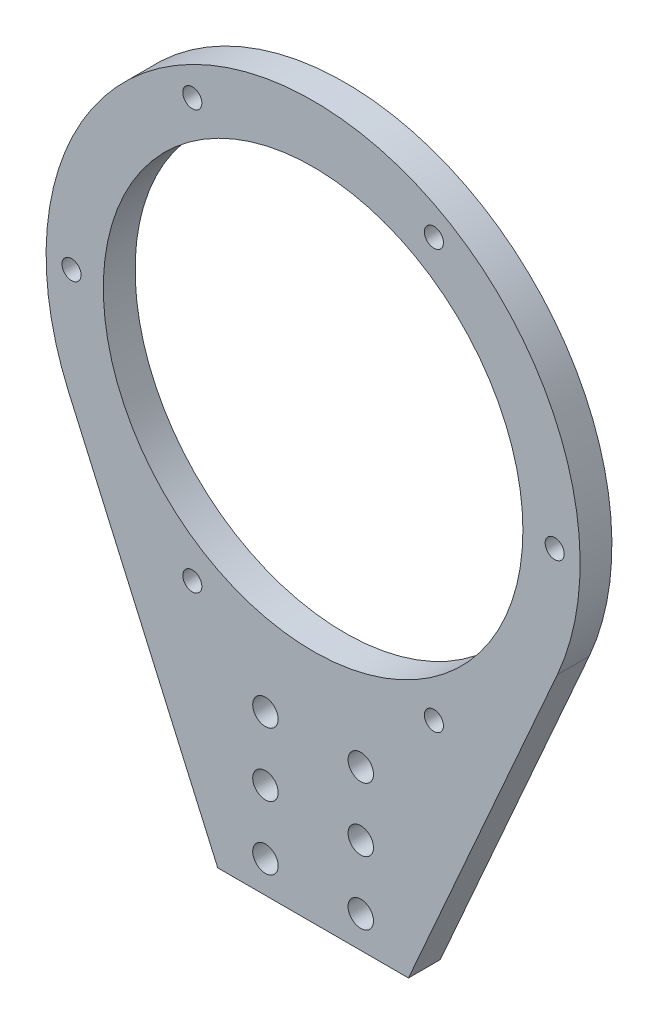
ISO-10303-21;
HEADER;
FILE_DESCRIPTION(('STEP AP214'),'2;1');
FILE_NAME('part.step','',(''),(''),'','','');
FILE_SCHEMA(('AUTOMOTIVE_DESIGN { 1 0 10303 214 1 1 1 1 }'));
ENDSEC;
DATA;
#1=APPLICATION_CONTEXT('core data for automotive mechanical design processes');
#2=APPLICATION_PROTOCOL_DEFINITION('international standard','automotive_design',2000,#1);
#3=PRODUCT_CONTEXT('',#1,'mechanical');
#4=PRODUCT('Part','Part','',(#3));
#5=PRODUCT_RELATED_PRODUCT_CATEGORY('part','',(#4));
#6=PRODUCT_DEFINITION_FORMATION('','',#4);
#7=PRODUCT_DEFINITION_CONTEXT('part definition',#1,'design');
#8=PRODUCT_DEFINITION('design','',#6,#7);
#9=PRODUCT_DEFINITION_SHAPE('','',#8);
#10=(LENGTH_UNIT() NAMED_UNIT(*) SI_UNIT(.MILLI.,.METRE.));
#11=(NAMED_UNIT(*) PLANE_ANGLE_UNIT() SI_UNIT($,.RADIAN.));
#12=(NAMED_UNIT(*) SI_UNIT($,.STERADIAN.) SOLID_ANGLE_UNIT());
#13=UNCERTAINTY_MEASURE_WITH_UNIT(LENGTH_MEASURE(1.E-05),#10,'distance_accuracy_value','');
#14=(GEOMETRIC_REPRESENTATION_CONTEXT(3) GLOBAL_UNCERTAINTY_ASSIGNED_CONTEXT((#13)) GLOBAL_UNIT_ASSIGNED_CONTEXT((#10,
#11,#12)) REPRESENTATION_CONTEXT('',''));
#15=CARTESIAN_POINT('',(0.,0.,0.));
#16=DIRECTION('',(0.,0.,1.));
#17=DIRECTION('',(1.,0.,0.));
#18=AXIS2_PLACEMENT_3D('',#15,#16,#17);
#19=CARTESIAN_POINT('',(0.,0.,5.));
#20=DIRECTION('',(0.,0.,-1.));
#21=DIRECTION('',(-1.,0.,0.));
#22=AXIS2_PLACEMENT_3D('',#19,#20,#21);
#23=CYLINDRICAL_SURFACE('',#22,42.);
#24=CARTESIAN_POINT('',(0.,0.,0.));
#25=DIRECTION('',(0.,0.,1.));
#26=DIRECTION('',(1.,0.,0.));
#27=AXIS2_PLACEMENT_3D('',#24,#25,#26);
#28=CIRCLE('',#27,42.);
#29=CARTESIAN_POINT('',(38.4202826454393,-16.967082290263,0.));
#30=VERTEX_POINT('',#29);
#31=CARTESIAN_POINT('',(-38.4202826454393,-16.967082290263,0.));
#32=VERTEX_POINT('',#31);
#33=EDGE_CURVE('E107',#30,#32,#28,.T.);
#34=ORIENTED_EDGE('',*,*,#33,.T.);
#35=DIRECTION('',(0.,0.,-1.));
#36=VECTOR('',#35,1.);
#37=CARTESIAN_POINT('',(-38.4202826454393,-16.967082290263,5.));
#38=LINE('',#37,#36);
#39=CARTESIAN_POINT('',(-38.4202826454393,-16.967082290263,5.));
#40=VERTEX_POINT('',#39);
#41=EDGE_CURVE('E11',#40,#32,#38,.T.);
#42=ORIENTED_EDGE('',*,*,#41,.F.);
#43=CARTESIAN_POINT('',(0.,0.,5.));
#44=DIRECTION('',(0.,0.,1.));
#45=DIRECTION('',(1.,0.,0.));
#46=AXIS2_PLACEMENT_3D('',#43,#44,#45);
#47=CIRCLE('',#46,42.);
#48=CARTESIAN_POINT('',(38.4202826454393,-16.967082290263,5.));
#49=VERTEX_POINT('',#48);
#50=EDGE_CURVE('E80',#49,#40,#47,.T.);
#51=ORIENTED_EDGE('',*,*,#50,.F.);
#52=DIRECTION('',(0.,0.,-1.));
#53=VECTOR('',#52,1.);
#54=CARTESIAN_POINT('',(38.4202826454393,-16.967082290263,5.));
#55=LINE('',#54,#53);
#56=EDGE_CURVE('E103',#49,#30,#55,.T.);
#57=ORIENTED_EDGE('',*,*,#56,.T.);
#58=EDGE_LOOP('',(#34,#42,#51,#57));
#59=FACE_BOUND('',#58,.T.);
#60=ADVANCED_FACE('F35',(#59),#23,.T.);
#61=CARTESIAN_POINT('',(-38.4202826454393,-16.967082290263,5.));
#62=DIRECTION('',(-0.914768634415221,-0.403978149768167,0.));
#63=DIRECTION('',(0.403978149768167,-0.914768634415221,0.));
#64=AXIS2_PLACEMENT_3D('',#61,#62,#63);
#65=PLANE('',#64);
#66=DIRECTION('',(-0.403978149768167,0.914768634415221,0.));
#67=VECTOR('',#66,1.);
#68=CARTESIAN_POINT('',(-38.4202826454393,-16.967082290263,0.));
#69=LINE('',#68,#67);
#70=CARTESIAN_POINT('',(-15.,-70.,0.));
#71=VERTEX_POINT('',#70);
#72=EDGE_CURVE('E90',#71,#32,#69,.T.);
#73=ORIENTED_EDGE('',*,*,#72,.F.);
#74=DIRECTION('',(0.,0.,-1.));
#75=VECTOR('',#74,1.);
#76=CARTESIAN_POINT('',(-15.,-70.,5.));
#77=LINE('',#76,#75);
#78=CARTESIAN_POINT('',(-15.,-70.,5.));
#79=VERTEX_POINT('',#78);
#80=EDGE_CURVE('E45',#79,#71,#77,.T.);
#81=ORIENTED_EDGE('',*,*,#80,.F.);
#82=DIRECTION('',(-0.403978149768167,0.914768634415221,0.));
#83=VECTOR('',#82,1.);
#84=CARTESIAN_POINT('',(-38.4202826454393,-16.967082290263,5.));
#85=LINE('',#84,#83);
#86=EDGE_CURVE('E88',#79,#40,#85,.T.);
#87=ORIENTED_EDGE('',*,*,#86,.T.);
#88=ORIENTED_EDGE('',*,*,#41,.T.);
#89=EDGE_LOOP('',(#73,#81,#87,#88));
#90=FACE_BOUND('',#89,.T.);
#91=ADVANCED_FACE('F87',(#90),#65,.T.);
#92=CARTESIAN_POINT('',(0.,-70.,5.));
#93=DIRECTION('',(0.,1.,0.));
#94=DIRECTION('',(0.,0.,1.));
#95=AXIS2_PLACEMENT_3D('',#92,#93,#94);
#96=PLANE('',#95);
#97=DIRECTION('',(1.,0.,0.));
#98=VECTOR('',#97,1.);
#99=CARTESIAN_POINT('',(0.,-70.,0.));
#100=LINE('',#99,#98);
#101=CARTESIAN_POINT('',(15.,-70.,0.));
#102=VERTEX_POINT('',#101);
#103=EDGE_CURVE('E69',#71,#102,#100,.T.);
#104=ORIENTED_EDGE('',*,*,#103,.T.);
#105=DIRECTION('',(0.,0.,-1.));
#106=VECTOR('',#105,1.);
#107=CARTESIAN_POINT('',(15.,-70.,5.));
#108=LINE('',#107,#106);
#109=CARTESIAN_POINT('',(15.,-70.,5.));
#110=VERTEX_POINT('',#109);
#111=EDGE_CURVE('E91',#110,#102,#108,.T.);
#112=ORIENTED_EDGE('',*,*,#111,.F.);
#113=DIRECTION('',(1.,0.,0.));
#114=VECTOR('',#113,1.);
#115=CARTESIAN_POINT('',(0.,-70.,5.));
#116=LINE('',#115,#114);
#117=EDGE_CURVE('E93',#79,#110,#116,.T.);
#118=ORIENTED_EDGE('',*,*,#117,.F.);
#119=ORIENTED_EDGE('',*,*,#80,.T.);
#120=EDGE_LOOP('',(#104,#112,#118,#119));
#121=FACE_BOUND('',#120,.T.);
#122=ADVANCED_FACE('F94',(#121),#96,.F.);
#123=CARTESIAN_POINT('',(0.,0.,5.));
#124=DIRECTION('',(0.,0.,-1.));
#125=DIRECTION('',(-1.,0.,0.));
#126=AXIS2_PLACEMENT_3D('',#123,#124,#125);
#127=CYLINDRICAL_SURFACE('',#126,33.);
#128=CARTESIAN_POINT('',(0.,0.,5.));
#129=DIRECTION('',(0.,0.,1.));
#130=DIRECTION('',(1.,0.,0.));
#131=AXIS2_PLACEMENT_3D('',#128,#129,#130);
#132=CIRCLE('',#131,33.);
#133=CARTESIAN_POINT('',(33.,0.,5.));
#134=VERTEX_POINT('',#133);
#135=EDGE_CURVE('E98',#134,#134,#132,.T.);
#136=ORIENTED_EDGE('',*,*,#135,.T.);
#137=EDGE_LOOP('',(#136));
#138=FACE_BOUND('',#137,.T.);
#139=CARTESIAN_POINT('',(0.,0.,0.));
#140=DIRECTION('',(0.,0.,1.));
#141=DIRECTION('',(1.,0.,0.));
#142=AXIS2_PLACEMENT_3D('',#139,#140,#141);
#143=CIRCLE('',#142,33.);
#144=CARTESIAN_POINT('',(33.,0.,0.));
#145=VERTEX_POINT('',#144);
#146=EDGE_CURVE('E104',#145,#145,#143,.T.);
#147=ORIENTED_EDGE('',*,*,#146,.F.);
#148=EDGE_LOOP('',(#147));
#149=FACE_BOUND('',#148,.T.);
#150=ADVANCED_FACE('F37',(#138,#149),#127,.F.);
#151=CARTESIAN_POINT('',(38.4202826454393,-16.967082290263,5.));
#152=DIRECTION('',(-0.914768634415221,0.403978149768166,0.));
#153=DIRECTION('',(-0.403978149768166,-0.914768634415221,0.));
#154=AXIS2_PLACEMENT_3D('',#151,#152,#153);
#155=PLANE('',#154);
#156=DIRECTION('',(0.403978149768166,0.914768634415221,0.));
#157=VECTOR('',#156,1.);
#158=CARTESIAN_POINT('',(38.4202826454393,-16.967082290263,0.));
#159=LINE('',#158,#157);
#160=EDGE_CURVE('E75',#102,#30,#159,.T.);
#161=ORIENTED_EDGE('',*,*,#160,.T.);
#162=ORIENTED_EDGE('',*,*,#56,.F.);
#163=DIRECTION('',(0.403978149768166,0.914768634415221,0.));
#164=VECTOR('',#163,1.);
#165=CARTESIAN_POINT('',(38.4202826454393,-16.967082290263,5.));
#166=LINE('',#165,#164);
#167=EDGE_CURVE('E54',#110,#49,#166,.T.);
#168=ORIENTED_EDGE('',*,*,#167,.F.);
#169=ORIENTED_EDGE('',*,*,#111,.T.);
#170=EDGE_LOOP('',(#161,#162,#168,#169));
#171=FACE_BOUND('',#170,.T.);
#172=ADVANCED_FACE('F173',(#171),#155,.F.);
#173=CARTESIAN_POINT('',(0.,0.,5.));
#174=DIRECTION('',(0.,0.,1.));
#175=DIRECTION('',(1.,0.,0.));
#176=AXIS2_PLACEMENT_3D('',#173,#174,#175);
#177=PLANE('',#176);
#178=CARTESIAN_POINT('',(7.50000000000001,-45.,5.));
#179=DIRECTION('',(0.,0.,1.));
#180=DIRECTION('',(1.,0.,0.));
#181=AXIS2_PLACEMENT_3D('',#178,#179,#180);
#182=CIRCLE('',#181,2.);
#183=CARTESIAN_POINT('',(9.50000000000001,-45.,5.));
#184=VERTEX_POINT('',#183);
#185=EDGE_CURVE('E338',#184,#184,#182,.T.);
#186=ORIENTED_EDGE('',*,*,#185,.F.);
#187=EDGE_LOOP('',(#186));
#188=FACE_BOUND('',#187,.T.);
#189=CARTESIAN_POINT('',(-7.49999999999999,-55.,5.));
#190=DIRECTION('',(0.,0.,1.));
#191=DIRECTION('',(1.,0.,0.));
#192=AXIS2_PLACEMENT_3D('',#189,#190,#191);
#193=CIRCLE('',#192,2.00000000000001);
#194=CARTESIAN_POINT('',(-5.49999999999999,-55.,5.));
#195=VERTEX_POINT('',#194);
#196=EDGE_CURVE('E339',#195,#195,#193,.T.);
#197=ORIENTED_EDGE('',*,*,#196,.F.);
#198=EDGE_LOOP('',(#197));
#199=FACE_BOUND('',#198,.T.);
#200=CARTESIAN_POINT('',(-7.49999999999999,-65.,5.));
#201=DIRECTION('',(0.,0.,1.));
#202=DIRECTION('',(1.,0.,0.));
#203=AXIS2_PLACEMENT_3D('',#200,#201,#202);
#204=CIRCLE('',#203,2.);
#205=CARTESIAN_POINT('',(-5.49999999999999,-65.,5.));
#206=VERTEX_POINT('',#205);
#207=EDGE_CURVE('E342',#206,#206,#204,.T.);
#208=ORIENTED_EDGE('',*,*,#207,.F.);
#209=EDGE_LOOP('',(#208));
#210=FACE_BOUND('',#209,.T.);
#211=CARTESIAN_POINT('',(7.50000000000001,-65.,5.));
#212=DIRECTION('',(0.,0.,1.));
#213=DIRECTION('',(1.,0.,0.));
#214=AXIS2_PLACEMENT_3D('',#211,#212,#213);
#215=CIRCLE('',#214,2.);
#216=CARTESIAN_POINT('',(9.50000000000001,-65.,5.));
#217=VERTEX_POINT('',#216);
#218=EDGE_CURVE('E380',#217,#217,#215,.T.);
#219=ORIENTED_EDGE('',*,*,#218,.F.);
#220=EDGE_LOOP('',(#219));
#221=FACE_BOUND('',#220,.T.);
#222=CARTESIAN_POINT('',(7.50000000000001,-55.,5.));
#223=DIRECTION('',(0.,0.,1.));
#224=DIRECTION('',(1.,0.,0.));
#225=AXIS2_PLACEMENT_3D('',#222,#223,#224);
#226=CIRCLE('',#225,2.);
#227=CARTESIAN_POINT('',(9.50000000000001,-55.,5.));
#228=VERTEX_POINT('',#227);
#229=EDGE_CURVE('E348',#228,#228,#226,.T.);
#230=ORIENTED_EDGE('',*,*,#229,.F.);
#231=EDGE_LOOP('',(#230));
#232=FACE_BOUND('',#231,.T.);
#233=CARTESIAN_POINT('',(-7.49999999999999,-45.,5.));
#234=DIRECTION('',(0.,0.,1.));
#235=DIRECTION('',(1.,0.,0.));
#236=AXIS2_PLACEMENT_3D('',#233,#234,#235);
#237=CIRCLE('',#236,2.);
#238=CARTESIAN_POINT('',(-5.49999999999999,-45.,5.));
#239=VERTEX_POINT('',#238);
#240=EDGE_CURVE('E138',#239,#239,#237,.T.);
#241=ORIENTED_EDGE('',*,*,#240,.F.);
#242=EDGE_LOOP('',(#241));
#243=FACE_BOUND('',#242,.T.);
#244=CARTESIAN_POINT('',(-19.0000000000002,32.9089653438086,5.));
#245=DIRECTION('',(0.,0.,1.));
#246=DIRECTION('',(1.,0.,0.));
#247=AXIS2_PLACEMENT_3D('',#244,#245,#246);
#248=CIRCLE('',#247,1.5);
#249=CARTESIAN_POINT('',(-17.5000000000002,32.9089653438086,5.));
#250=VERTEX_POINT('',#249);
#251=EDGE_CURVE('E151',#250,#250,#248,.T.);
#252=ORIENTED_EDGE('',*,*,#251,.F.);
#253=EDGE_LOOP('',(#252));
#254=FACE_BOUND('',#253,.T.);
#255=CARTESIAN_POINT('',(-38.,0.,5.));
#256=DIRECTION('',(0.,0.,1.));
#257=DIRECTION('',(1.,0.,0.));
#258=AXIS2_PLACEMENT_3D('',#255,#256,#257);
#259=CIRCLE('',#258,1.5);
#260=CARTESIAN_POINT('',(-36.5,0.,5.));
#261=VERTEX_POINT('',#260);
#262=EDGE_CURVE('E155',#261,#261,#259,.T.);
#263=ORIENTED_EDGE('',*,*,#262,.F.);
#264=EDGE_LOOP('',(#263));
#265=FACE_BOUND('',#264,.T.);
#266=CARTESIAN_POINT('',(-19.0000000000001,-32.9089653438086,5.));
#267=DIRECTION('',(0.,0.,1.));
#268=DIRECTION('',(1.,0.,0.));
#269=AXIS2_PLACEMENT_3D('',#266,#267,#268);
#270=CIRCLE('',#269,1.5);
#271=CARTESIAN_POINT('',(-17.5000000000001,-32.9089653438086,5.));
#272=VERTEX_POINT('',#271);
#273=EDGE_CURVE('E160',#272,#272,#270,.T.);
#274=ORIENTED_EDGE('',*,*,#273,.F.);
#275=EDGE_LOOP('',(#274));
#276=FACE_BOUND('',#275,.T.);
#277=CARTESIAN_POINT('',(19.0000000000002,-32.9089653438086,5.));
#278=DIRECTION('',(0.,0.,1.));
#279=DIRECTION('',(1.,0.,0.));
#280=AXIS2_PLACEMENT_3D('',#277,#278,#279);
#281=CIRCLE('',#280,1.50000000000001);
#282=CARTESIAN_POINT('',(20.5000000000002,-32.9089653438086,5.));
#283=VERTEX_POINT('',#282);
#284=EDGE_CURVE('E351',#283,#283,#281,.T.);
#285=ORIENTED_EDGE('',*,*,#284,.F.);
#286=EDGE_LOOP('',(#285));
#287=FACE_BOUND('',#286,.T.);
#288=CARTESIAN_POINT('',(38.,0.,5.));
#289=DIRECTION('',(0.,0.,1.));
#290=DIRECTION('',(1.,0.,0.));
#291=AXIS2_PLACEMENT_3D('',#288,#289,#290);
#292=CIRCLE('',#291,1.5);
#293=CARTESIAN_POINT('',(39.5,0.,5.));
#294=VERTEX_POINT('',#293);
#295=EDGE_CURVE('E165',#294,#294,#292,.T.);
#296=ORIENTED_EDGE('',*,*,#295,.F.);
#297=EDGE_LOOP('',(#296));
#298=FACE_BOUND('',#297,.T.);
#299=CARTESIAN_POINT('',(19.0000000000001,32.9089653438086,5.));
#300=DIRECTION('',(0.,0.,1.));
#301=DIRECTION('',(1.,0.,0.));
#302=AXIS2_PLACEMENT_3D('',#299,#300,#301);
#303=CIRCLE('',#302,1.5);
#304=CARTESIAN_POINT('',(20.5000000000001,32.9089653438086,5.));
#305=VERTEX_POINT('',#304);
#306=EDGE_CURVE('E120',#305,#305,#303,.T.);
#307=ORIENTED_EDGE('',*,*,#306,.F.);
#308=EDGE_LOOP('',(#307));
#309=FACE_BOUND('',#308,.T.);
#310=ORIENTED_EDGE('',*,*,#135,.F.);
#311=EDGE_LOOP('',(#310));
#312=FACE_BOUND('',#311,.T.);
#313=ORIENTED_EDGE('',*,*,#50,.T.);
#314=ORIENTED_EDGE('',*,*,#86,.F.);
#315=ORIENTED_EDGE('',*,*,#117,.T.);
#316=ORIENTED_EDGE('',*,*,#167,.T.);
#317=EDGE_LOOP('',(#313,#314,#315,#316));
#318=FACE_BOUND('',#317,.T.);
#319=ADVANCED_FACE('F96',(#188,#199,#210,#221,#232,#243,#254,#265,#276,#287,#298,#309,#312,
#318),#177,.T.);
#320=CARTESIAN_POINT('',(0.,0.,0.));
#321=DIRECTION('',(0.,0.,1.));
#322=DIRECTION('',(1.,0.,0.));
#323=AXIS2_PLACEMENT_3D('',#320,#321,#322);
#324=PLANE('',#323);
#325=CARTESIAN_POINT('',(7.50000000000001,-45.,0.));
#326=DIRECTION('',(0.,0.,1.));
#327=DIRECTION('',(1.,0.,0.));
#328=AXIS2_PLACEMENT_3D('',#325,#326,#327);
#329=CIRCLE('',#328,2.);
#330=CARTESIAN_POINT('',(9.50000000000001,-45.,0.));
#331=VERTEX_POINT('',#330);
#332=EDGE_CURVE('E39',#331,#331,#329,.T.);
#333=ORIENTED_EDGE('',*,*,#332,.T.);
#334=EDGE_LOOP('',(#333));
#335=FACE_BOUND('',#334,.T.);
#336=CARTESIAN_POINT('',(-7.49999999999999,-55.,0.));
#337=DIRECTION('',(0.,0.,1.));
#338=DIRECTION('',(1.,0.,0.));
#339=AXIS2_PLACEMENT_3D('',#336,#337,#338);
#340=CIRCLE('',#339,2.00000000000001);
#341=CARTESIAN_POINT('',(-5.49999999999999,-55.,0.));
#342=VERTEX_POINT('',#341);
#343=EDGE_CURVE('E146',#342,#342,#340,.T.);
#344=ORIENTED_EDGE('',*,*,#343,.T.);
#345=EDGE_LOOP('',(#344));
#346=FACE_BOUND('',#345,.T.);
#347=CARTESIAN_POINT('',(-7.49999999999999,-65.,0.));
#348=DIRECTION('',(0.,0.,1.));
#349=DIRECTION('',(1.,0.,0.));
#350=AXIS2_PLACEMENT_3D('',#347,#348,#349);
#351=CIRCLE('',#350,2.);
#352=CARTESIAN_POINT('',(-5.49999999999999,-65.,0.));
#353=VERTEX_POINT('',#352);
#354=EDGE_CURVE('E144',#353,#353,#351,.T.);
#355=ORIENTED_EDGE('',*,*,#354,.T.);
#356=EDGE_LOOP('',(#355));
#357=FACE_BOUND('',#356,.T.);
#358=CARTESIAN_POINT('',(7.50000000000001,-65.,0.));
#359=DIRECTION('',(0.,0.,1.));
#360=DIRECTION('',(1.,0.,0.));
#361=AXIS2_PLACEMENT_3D('',#358,#359,#360);
#362=CIRCLE('',#361,2.);
#363=CARTESIAN_POINT('',(9.50000000000001,-65.,0.));
#364=VERTEX_POINT('',#363);
#365=EDGE_CURVE('E141',#364,#364,#362,.T.);
#366=ORIENTED_EDGE('',*,*,#365,.T.);
#367=EDGE_LOOP('',(#366));
#368=FACE_BOUND('',#367,.T.);
#369=CARTESIAN_POINT('',(7.50000000000001,-55.,0.));
#370=DIRECTION('',(0.,0.,1.));
#371=DIRECTION('',(1.,0.,0.));
#372=AXIS2_PLACEMENT_3D('',#369,#370,#371);
#373=CIRCLE('',#372,2.);
#374=CARTESIAN_POINT('',(9.50000000000001,-55.,0.));
#375=VERTEX_POINT('',#374);
#376=EDGE_CURVE('E137',#375,#375,#373,.T.);
#377=ORIENTED_EDGE('',*,*,#376,.T.);
#378=EDGE_LOOP('',(#377));
#379=FACE_BOUND('',#378,.T.);
#380=CARTESIAN_POINT('',(-7.49999999999999,-45.,0.));
#381=DIRECTION('',(0.,0.,1.));
#382=DIRECTION('',(1.,0.,0.));
#383=AXIS2_PLACEMENT_3D('',#380,#381,#382);
#384=CIRCLE('',#383,2.);
#385=CARTESIAN_POINT('',(-5.49999999999999,-45.,0.));
#386=VERTEX_POINT('',#385);
#387=EDGE_CURVE('E134',#386,#386,#384,.T.);
#388=ORIENTED_EDGE('',*,*,#387,.T.);
#389=EDGE_LOOP('',(#388));
#390=FACE_BOUND('',#389,.T.);
#391=CARTESIAN_POINT('',(-19.0000000000002,32.9089653438086,0.));
#392=DIRECTION('',(0.,0.,1.));
#393=DIRECTION('',(1.,0.,0.));
#394=AXIS2_PLACEMENT_3D('',#391,#392,#393);
#395=CIRCLE('',#394,1.5);
#396=CARTESIAN_POINT('',(-17.5000000000002,32.9089653438086,0.));
#397=VERTEX_POINT('',#396);
#398=EDGE_CURVE('E108',#397,#397,#395,.T.);
#399=ORIENTED_EDGE('',*,*,#398,.T.);
#400=EDGE_LOOP('',(#399));
#401=FACE_BOUND('',#400,.T.);
#402=CARTESIAN_POINT('',(-38.,0.,0.));
#403=DIRECTION('',(0.,0.,1.));
#404=DIRECTION('',(1.,0.,0.));
#405=AXIS2_PLACEMENT_3D('',#402,#403,#404);
#406=CIRCLE('',#405,1.5);
#407=CARTESIAN_POINT('',(-36.5,0.,0.));
#408=VERTEX_POINT('',#407);
#409=EDGE_CURVE('E129',#408,#408,#406,.T.);
#410=ORIENTED_EDGE('',*,*,#409,.T.);
#411=EDGE_LOOP('',(#410));
#412=FACE_BOUND('',#411,.T.);
#413=CARTESIAN_POINT('',(-19.0000000000001,-32.9089653438086,0.));
#414=DIRECTION('',(0.,0.,1.));
#415=DIRECTION('',(1.,0.,0.));
#416=AXIS2_PLACEMENT_3D('',#413,#414,#415);
#417=CIRCLE('',#416,1.5);
#418=CARTESIAN_POINT('',(-17.5000000000001,-32.9089653438086,0.));
#419=VERTEX_POINT('',#418);
#420=EDGE_CURVE('E126',#419,#419,#417,.T.);
#421=ORIENTED_EDGE('',*,*,#420,.T.);
#422=EDGE_LOOP('',(#421));
#423=FACE_BOUND('',#422,.T.);
#424=CARTESIAN_POINT('',(19.0000000000002,-32.9089653438086,0.));
#425=DIRECTION('',(0.,0.,1.));
#426=DIRECTION('',(1.,0.,0.));
#427=AXIS2_PLACEMENT_3D('',#424,#425,#426);
#428=CIRCLE('',#427,1.50000000000001);
#429=CARTESIAN_POINT('',(20.5000000000002,-32.9089653438086,0.));
#430=VERTEX_POINT('',#429);
#431=EDGE_CURVE('E123',#430,#430,#428,.T.);
#432=ORIENTED_EDGE('',*,*,#431,.T.);
#433=EDGE_LOOP('',(#432));
#434=FACE_BOUND('',#433,.T.);
#435=CARTESIAN_POINT('',(38.,0.,0.));
#436=DIRECTION('',(0.,0.,1.));
#437=DIRECTION('',(1.,0.,0.));
#438=AXIS2_PLACEMENT_3D('',#435,#436,#437);
#439=CIRCLE('',#438,1.5);
#440=CARTESIAN_POINT('',(39.5,0.,0.));
#441=VERTEX_POINT('',#440);
#442=EDGE_CURVE('E119',#441,#441,#439,.T.);
#443=ORIENTED_EDGE('',*,*,#442,.T.);
#444=EDGE_LOOP('',(#443));
#445=FACE_BOUND('',#444,.T.);
#446=CARTESIAN_POINT('',(19.0000000000001,32.9089653438086,0.));
#447=DIRECTION('',(0.,0.,1.));
#448=DIRECTION('',(1.,0.,0.));
#449=AXIS2_PLACEMENT_3D('',#446,#447,#448);
#450=CIRCLE('',#449,1.5);
#451=CARTESIAN_POINT('',(20.5000000000001,32.9089653438086,0.));
#452=VERTEX_POINT('',#451);
#453=EDGE_CURVE('E116',#452,#452,#450,.T.);
#454=ORIENTED_EDGE('',*,*,#453,.T.);
#455=EDGE_LOOP('',(#454));
#456=FACE_BOUND('',#455,.T.);
#457=ORIENTED_EDGE('',*,*,#146,.T.);
#458=EDGE_LOOP('',(#457));
#459=FACE_BOUND('',#458,.T.);
#460=ORIENTED_EDGE('',*,*,#33,.F.);
#461=ORIENTED_EDGE('',*,*,#160,.F.);
#462=ORIENTED_EDGE('',*,*,#103,.F.);
#463=ORIENTED_EDGE('',*,*,#72,.T.);
#464=EDGE_LOOP('',(#460,#461,#462,#463));
#465=FACE_BOUND('',#464,.T.);
#466=ADVANCED_FACE('F172',(#335,#346,#357,#368,#379,#390,#401,#412,#423,#434,#445,#456,#459,
#465),#324,.F.);
#467=CARTESIAN_POINT('',(19.0000000000001,32.9089653438086,-2.));
#468=DIRECTION('',(0.,0.,1.));
#469=DIRECTION('',(1.,0.,0.));
#470=AXIS2_PLACEMENT_3D('',#467,#468,#469);
#471=CYLINDRICAL_SURFACE('',#470,1.5);
#472=ORIENTED_EDGE('',*,*,#306,.T.);
#473=EDGE_LOOP('',(#472));
#474=FACE_BOUND('',#473,.T.);
#475=ORIENTED_EDGE('',*,*,#453,.F.);
#476=EDGE_LOOP('',(#475));
#477=FACE_BOUND('',#476,.T.);
#478=ADVANCED_FACE('F180',(#474,#477),#471,.F.);
#479=CARTESIAN_POINT('',(38.,0.,-2.));
#480=DIRECTION('',(0.,0.,1.));
#481=DIRECTION('',(1.,0.,0.));
#482=AXIS2_PLACEMENT_3D('',#479,#480,#481);
#483=CYLINDRICAL_SURFACE('',#482,1.5);
#484=ORIENTED_EDGE('',*,*,#295,.T.);
#485=EDGE_LOOP('',(#484));
#486=FACE_BOUND('',#485,.T.);
#487=ORIENTED_EDGE('',*,*,#442,.F.);
#488=EDGE_LOOP('',(#487));
#489=FACE_BOUND('',#488,.T.);
#490=ADVANCED_FACE('F213',(#486,#489),#483,.F.);
#491=CARTESIAN_POINT('',(19.0000000000002,-32.9089653438086,-2.));
#492=DIRECTION('',(0.,0.,1.));
#493=DIRECTION('',(1.,0.,0.));
#494=AXIS2_PLACEMENT_3D('',#491,#492,#493);
#495=CYLINDRICAL_SURFACE('',#494,1.50000000000001);
#496=ORIENTED_EDGE('',*,*,#284,.T.);
#497=EDGE_LOOP('',(#496));
#498=FACE_BOUND('',#497,.T.);
#499=ORIENTED_EDGE('',*,*,#431,.F.);
#500=EDGE_LOOP('',(#499));
#501=FACE_BOUND('',#500,.T.);
#502=ADVANCED_FACE('F223',(#498,#501),#495,.F.);
#503=CARTESIAN_POINT('',(-19.0000000000001,-32.9089653438086,-2.));
#504=DIRECTION('',(0.,0.,1.));
#505=DIRECTION('',(1.,0.,0.));
#506=AXIS2_PLACEMENT_3D('',#503,#504,#505);
#507=CYLINDRICAL_SURFACE('',#506,1.5);
#508=ORIENTED_EDGE('',*,*,#273,.T.);
#509=EDGE_LOOP('',(#508));
#510=FACE_BOUND('',#509,.T.);
#511=ORIENTED_EDGE('',*,*,#420,.F.);
#512=EDGE_LOOP('',(#511));
#513=FACE_BOUND('',#512,.T.);
#514=ADVANCED_FACE('F233',(#510,#513),#507,.F.);
#515=CARTESIAN_POINT('',(-38.,0.,-2.));
#516=DIRECTION('',(0.,0.,1.));
#517=DIRECTION('',(1.,0.,0.));
#518=AXIS2_PLACEMENT_3D('',#515,#516,#517);
#519=CYLINDRICAL_SURFACE('',#518,1.5);
#520=ORIENTED_EDGE('',*,*,#262,.T.);
#521=EDGE_LOOP('',(#520));
#522=FACE_BOUND('',#521,.T.);
#523=ORIENTED_EDGE('',*,*,#409,.F.);
#524=EDGE_LOOP('',(#523));
#525=FACE_BOUND('',#524,.T.);
#526=ADVANCED_FACE('F243',(#522,#525),#519,.F.);
#527=CARTESIAN_POINT('',(-19.0000000000002,32.9089653438086,-2.));
#528=DIRECTION('',(0.,0.,1.));
#529=DIRECTION('',(1.,0.,0.));
#530=AXIS2_PLACEMENT_3D('',#527,#528,#529);
#531=CYLINDRICAL_SURFACE('',#530,1.5);
#532=ORIENTED_EDGE('',*,*,#251,.T.);
#533=EDGE_LOOP('',(#532));
#534=FACE_BOUND('',#533,.T.);
#535=ORIENTED_EDGE('',*,*,#398,.F.);
#536=EDGE_LOOP('',(#535));
#537=FACE_BOUND('',#536,.T.);
#538=ADVANCED_FACE('F253',(#534,#537),#531,.F.);
#539=CARTESIAN_POINT('',(-7.49999999999999,-45.,-2.));
#540=DIRECTION('',(0.,0.,1.));
#541=DIRECTION('',(1.,0.,0.));
#542=AXIS2_PLACEMENT_3D('',#539,#540,#541);
#543=CYLINDRICAL_SURFACE('',#542,2.);
#544=ORIENTED_EDGE('',*,*,#240,.T.);
#545=EDGE_LOOP('',(#544));
#546=FACE_BOUND('',#545,.T.);
#547=ORIENTED_EDGE('',*,*,#387,.F.);
#548=EDGE_LOOP('',(#547));
#549=FACE_BOUND('',#548,.T.);
#550=ADVANCED_FACE('F262',(#546,#549),#543,.F.);
#551=CARTESIAN_POINT('',(7.50000000000001,-55.,-2.));
#552=DIRECTION('',(0.,0.,1.));
#553=DIRECTION('',(1.,0.,0.));
#554=AXIS2_PLACEMENT_3D('',#551,#552,#553);
#555=CYLINDRICAL_SURFACE('',#554,2.);
#556=ORIENTED_EDGE('',*,*,#229,.T.);
#557=EDGE_LOOP('',(#556));
#558=FACE_BOUND('',#557,.T.);
#559=ORIENTED_EDGE('',*,*,#376,.F.);
#560=EDGE_LOOP('',(#559));
#561=FACE_BOUND('',#560,.T.);
#562=ADVANCED_FACE('F282',(#558,#561),#555,.F.);
#563=CARTESIAN_POINT('',(7.50000000000001,-65.,-2.));
#564=DIRECTION('',(0.,0.,1.));
#565=DIRECTION('',(1.,0.,0.));
#566=AXIS2_PLACEMENT_3D('',#563,#564,#565);
#567=CYLINDRICAL_SURFACE('',#566,2.);
#568=ORIENTED_EDGE('',*,*,#218,.T.);
#569=EDGE_LOOP('',(#568));
#570=FACE_BOUND('',#569,.T.);
#571=ORIENTED_EDGE('',*,*,#365,.F.);
#572=EDGE_LOOP('',(#571));
#573=FACE_BOUND('',#572,.T.);
#574=ADVANCED_FACE('F292',(#570,#573),#567,.F.);
#575=CARTESIAN_POINT('',(-7.49999999999999,-65.,-2.));
#576=DIRECTION('',(0.,0.,1.));
#577=DIRECTION('',(1.,0.,0.));
#578=AXIS2_PLACEMENT_3D('',#575,#576,#577);
#579=CYLINDRICAL_SURFACE('',#578,2.);
#580=ORIENTED_EDGE('',*,*,#207,.T.);
#581=EDGE_LOOP('',(#580));
#582=FACE_BOUND('',#581,.T.);
#583=ORIENTED_EDGE('',*,*,#354,.F.);
#584=EDGE_LOOP('',(#583));
#585=FACE_BOUND('',#584,.T.);
#586=ADVANCED_FACE('F302',(#582,#585),#579,.F.);
#587=CARTESIAN_POINT('',(-7.49999999999999,-55.,-2.));
#588=DIRECTION('',(0.,0.,1.));
#589=DIRECTION('',(1.,0.,0.));
#590=AXIS2_PLACEMENT_3D('',#587,#588,#589);
#591=CYLINDRICAL_SURFACE('',#590,2.00000000000001);
#592=ORIENTED_EDGE('',*,*,#196,.T.);
#593=EDGE_LOOP('',(#592));
#594=FACE_BOUND('',#593,.T.);
#595=ORIENTED_EDGE('',*,*,#343,.F.);
#596=EDGE_LOOP('',(#595));
#597=FACE_BOUND('',#596,.T.);
#598=ADVANCED_FACE('F312',(#594,#597),#591,.F.);
#599=CARTESIAN_POINT('',(7.50000000000001,-45.,-2.));
#600=DIRECTION('',(0.,0.,1.));
#601=DIRECTION('',(1.,0.,0.));
#602=AXIS2_PLACEMENT_3D('',#599,#600,#601);
#603=CYLINDRICAL_SURFACE('',#602,2.);
#604=ORIENTED_EDGE('',*,*,#185,.T.);
#605=EDGE_LOOP('',(#604));
#606=FACE_BOUND('',#605,.T.);
#607=ORIENTED_EDGE('',*,*,#332,.F.);
#608=EDGE_LOOP('',(#607));
#609=FACE_BOUND('',#608,.T.);
#610=ADVANCED_FACE('F322',(#606,#609),#603,.F.);
#611=CLOSED_SHELL('',(#60,#91,#122,#150,#172,#319,#466,#478,#490,#502,#514,#526,#538,#550,#562,
#574,#586,#598,#610));
#612=MANIFOLD_SOLID_BREP('B2',#611);
#613=ADVANCED_BREP_SHAPE_REPRESENTATION('',(#18,#612),#14);
#614=SHAPE_DEFINITION_REPRESENTATION(#9,#613);
ENDSEC;
END-ISO-10303-21;
